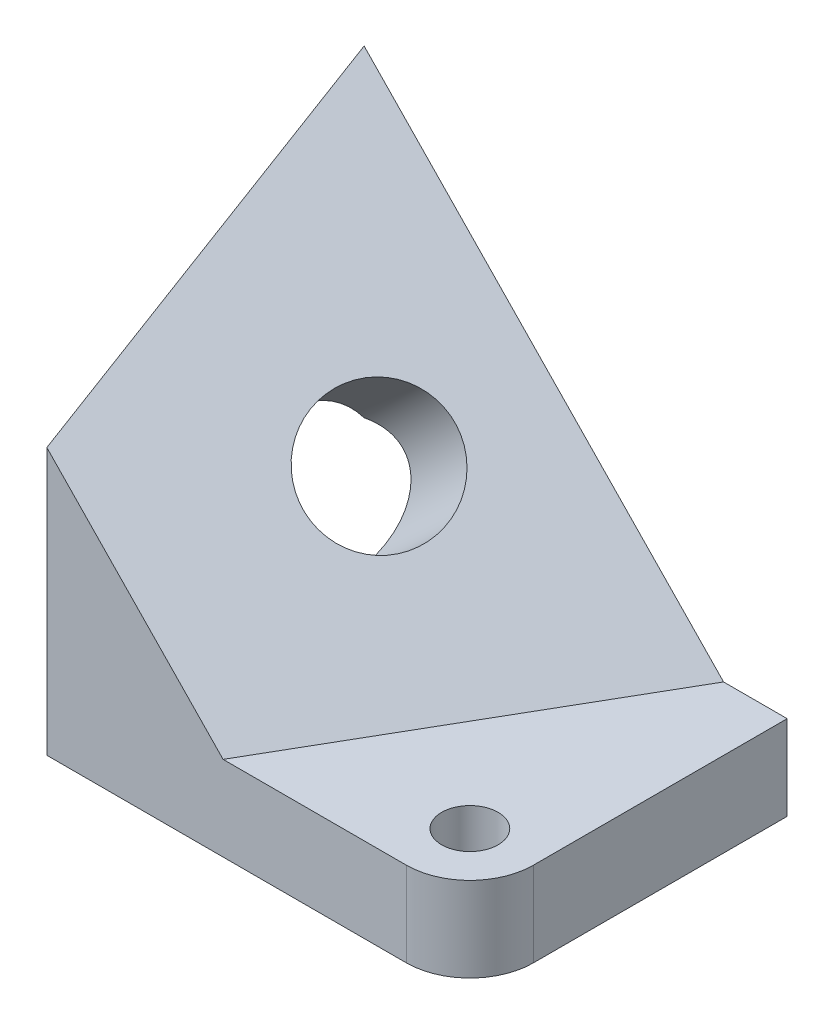
ISO-10303-21;
HEADER;
FILE_DESCRIPTION(('STEP AP214'),'2;1');
FILE_NAME('part.step','',(''),(''),'','','');
FILE_SCHEMA(('AUTOMOTIVE_DESIGN { 1 0 10303 214 1 1 1 1 }'));
ENDSEC;
DATA;
#1=APPLICATION_CONTEXT('core data for automotive mechanical design processes');
#2=APPLICATION_PROTOCOL_DEFINITION('international standard','automotive_design',2000,#1);
#3=PRODUCT_CONTEXT('',#1,'mechanical');
#4=PRODUCT('Part','Part','',(#3));
#5=PRODUCT_RELATED_PRODUCT_CATEGORY('part','',(#4));
#6=PRODUCT_DEFINITION_FORMATION('','',#4);
#7=PRODUCT_DEFINITION_CONTEXT('part definition',#1,'design');
#8=PRODUCT_DEFINITION('design','',#6,#7);
#9=PRODUCT_DEFINITION_SHAPE('','',#8);
#10=(LENGTH_UNIT() NAMED_UNIT(*) SI_UNIT(.MILLI.,.METRE.));
#11=(NAMED_UNIT(*) PLANE_ANGLE_UNIT() SI_UNIT($,.RADIAN.));
#12=(NAMED_UNIT(*) SI_UNIT($,.STERADIAN.) SOLID_ANGLE_UNIT());
#13=UNCERTAINTY_MEASURE_WITH_UNIT(LENGTH_MEASURE(1.E-05),#10,'distance_accuracy_value','');
#14=(GEOMETRIC_REPRESENTATION_CONTEXT(3) GLOBAL_UNCERTAINTY_ASSIGNED_CONTEXT((#13)) GLOBAL_UNIT_ASSIGNED_CONTEXT((#10,
#11,#12)) REPRESENTATION_CONTEXT('',''));
#15=CARTESIAN_POINT('',(0.,0.,0.));
#16=DIRECTION('',(0.,0.,1.));
#17=DIRECTION('',(1.,0.,0.));
#18=AXIS2_PLACEMENT_3D('',#15,#16,#17);
#19=CARTESIAN_POINT('',(21.,12.,13.5));
#20=DIRECTION('',(0.,1.,0.));
#21=DIRECTION('',(0.,0.,1.));
#22=AXIS2_PLACEMENT_3D('',#19,#20,#21);
#23=PLANE('',#22);
#24=DIRECTION('',(0.499999999999998,0.,-0.86602540378444));
#25=VECTOR('',#24,1.);
#26=CARTESIAN_POINT('',(-5.,12.,22.5));
#27=LINE('',#26,#25);
#28=CARTESIAN_POINT('',(-5.,12.,22.5));
#29=VERTEX_POINT('',#28);
#30=CARTESIAN_POINT('',(20.980762113533,12.,-22.5));
#31=VERTEX_POINT('',#30);
#32=EDGE_CURVE('E177',#29,#31,#27,.T.);
#33=ORIENTED_EDGE('',*,*,#32,.F.);
#34=DIRECTION('',(1.,0.,0.));
#35=VECTOR('',#34,1.);
#36=CARTESIAN_POINT('',(-30.,12.,22.5));
#37=LINE('',#36,#35);
#38=CARTESIAN_POINT('',(21.,12.,22.5));
#39=VERTEX_POINT('',#38);
#40=EDGE_CURVE('E170',#29,#39,#37,.T.);
#41=ORIENTED_EDGE('',*,*,#40,.T.);
#42=CARTESIAN_POINT('',(21.,12.,13.5));
#43=DIRECTION('',(0.,1.,0.));
#44=DIRECTION('',(0.,0.,1.));
#45=AXIS2_PLACEMENT_3D('',#42,#43,#44);
#46=CIRCLE('',#45,9.);
#47=CARTESIAN_POINT('',(30.,12.,13.5));
#48=VERTEX_POINT('',#47);
#49=EDGE_CURVE('E146',#39,#48,#46,.T.);
#50=ORIENTED_EDGE('',*,*,#49,.T.);
#51=DIRECTION('',(0.,0.,-1.));
#52=VECTOR('',#51,1.);
#53=CARTESIAN_POINT('',(30.,12.,-22.5));
#54=LINE('',#53,#52);
#55=CARTESIAN_POINT('',(30.,12.,-22.5));
#56=VERTEX_POINT('',#55);
#57=EDGE_CURVE('E127',#48,#56,#54,.T.);
#58=ORIENTED_EDGE('',*,*,#57,.T.);
#59=DIRECTION('',(-1.,0.,0.));
#60=VECTOR('',#59,1.);
#61=CARTESIAN_POINT('',(-30.,12.,-22.5));
#62=LINE('',#61,#60);
#63=EDGE_CURVE('E121',#56,#31,#62,.T.);
#64=ORIENTED_EDGE('',*,*,#63,.T.);
#65=EDGE_LOOP('',(#33,#41,#50,#58,#64));
#66=FACE_BOUND('',#65,.T.);
#67=CARTESIAN_POINT('',(21.,12.,13.5));
#68=DIRECTION('',(0.,1.,0.));
#69=DIRECTION('',(0.,0.,1.));
#70=AXIS2_PLACEMENT_3D('',#67,#68,#69);
#71=CIRCLE('',#70,4.);
#72=CARTESIAN_POINT('',(21.,12.,17.5));
#73=VERTEX_POINT('',#72);
#74=EDGE_CURVE('E164',#73,#73,#71,.T.);
#75=ORIENTED_EDGE('',*,*,#74,.F.);
#76=EDGE_LOOP('',(#75));
#77=FACE_BOUND('',#76,.T.);
#78=ADVANCED_FACE('F41',(#66,#77),#23,.T.);
#79=CARTESIAN_POINT('',(21.,0.,13.5));
#80=DIRECTION('',(0.,1.,0.));
#81=DIRECTION('',(0.,0.,1.));
#82=AXIS2_PLACEMENT_3D('',#79,#80,#81);
#83=PLANE('',#82);
#84=DIRECTION('',(0.,0.,1.));
#85=VECTOR('',#84,1.);
#86=CARTESIAN_POINT('',(-30.,0.,-22.5));
#87=LINE('',#86,#85);
#88=CARTESIAN_POINT('',(-30.,0.,-22.5));
#89=VERTEX_POINT('',#88);
#90=CARTESIAN_POINT('',(-30.,0.,22.5));
#91=VERTEX_POINT('',#90);
#92=EDGE_CURVE('E160',#89,#91,#87,.T.);
#93=ORIENTED_EDGE('',*,*,#92,.F.);
#94=DIRECTION('',(-1.,0.,0.));
#95=VECTOR('',#94,1.);
#96=CARTESIAN_POINT('',(-30.,0.,-22.5));
#97=LINE('',#96,#95);
#98=CARTESIAN_POINT('',(30.,0.,-22.5));
#99=VERTEX_POINT('',#98);
#100=EDGE_CURVE('E118',#99,#89,#97,.T.);
#101=ORIENTED_EDGE('',*,*,#100,.F.);
#102=DIRECTION('',(0.,0.,-1.));
#103=VECTOR('',#102,1.);
#104=CARTESIAN_POINT('',(30.,0.,-22.5));
#105=LINE('',#104,#103);
#106=CARTESIAN_POINT('',(30.,0.,13.5));
#107=VERTEX_POINT('',#106);
#108=EDGE_CURVE('E155',#107,#99,#105,.T.);
#109=ORIENTED_EDGE('',*,*,#108,.F.);
#110=CARTESIAN_POINT('',(21.,0.,13.5));
#111=DIRECTION('',(0.,1.,0.));
#112=DIRECTION('',(0.,0.,1.));
#113=AXIS2_PLACEMENT_3D('',#110,#111,#112);
#114=CIRCLE('',#113,9.);
#115=CARTESIAN_POINT('',(21.,0.,22.5));
#116=VERTEX_POINT('',#115);
#117=EDGE_CURVE('E145',#116,#107,#114,.T.);
#118=ORIENTED_EDGE('',*,*,#117,.F.);
#119=DIRECTION('',(1.,0.,0.));
#120=VECTOR('',#119,1.);
#121=CARTESIAN_POINT('',(-30.,0.,22.5));
#122=LINE('',#121,#120);
#123=EDGE_CURVE('E154',#91,#116,#122,.T.);
#124=ORIENTED_EDGE('',*,*,#123,.F.);
#125=EDGE_LOOP('',(#93,#101,#109,#118,#124));
#126=FACE_BOUND('',#125,.T.);
#127=CARTESIAN_POINT('',(21.,0.,13.5));
#128=DIRECTION('',(0.,1.,0.));
#129=DIRECTION('',(0.,0.,1.));
#130=AXIS2_PLACEMENT_3D('',#127,#128,#129);
#131=CIRCLE('',#130,4.);
#132=CARTESIAN_POINT('',(21.,0.,17.5));
#133=VERTEX_POINT('',#132);
#134=EDGE_CURVE('E173',#133,#133,#131,.T.);
#135=ORIENTED_EDGE('',*,*,#134,.T.);
#136=EDGE_LOOP('',(#135));
#137=FACE_BOUND('',#136,.T.);
#138=ADVANCED_FACE('F152',(#126,#137),#83,.F.);
#139=CARTESIAN_POINT('',(-30.,12.,-22.5));
#140=DIRECTION('',(1.,0.,0.));
#141=DIRECTION('',(0.,0.,-1.));
#142=AXIS2_PLACEMENT_3D('',#139,#140,#141);
#143=PLANE('',#142);
#144=DIRECTION('',(0.,-1.,0.));
#145=VECTOR('',#144,1.);
#146=CARTESIAN_POINT('',(-30.,12.,-22.5));
#147=LINE('',#146,#145);
#148=CARTESIAN_POINT('',(-30.,64.616677989318,-22.5));
#149=VERTEX_POINT('',#148);
#150=CARTESIAN_POINT('',(-30.,18.9520718845685,-22.5));
#151=VERTEX_POINT('',#150);
#152=EDGE_CURVE('E111',#149,#151,#147,.T.);
#153=ORIENTED_EDGE('',*,*,#152,.T.);
#154=CARTESIAN_POINT('',(-30.,12.5856514104136,-15.9448637286707));
#155=DIRECTION('',(1.,0.,0.));
#156=DIRECTION('',(0.,0.859051637355621,0.511888937521243));
#157=AXIS2_PLACEMENT_3D('',#154,#155,#156);
#158=ELLIPSE('',#157,13.5661904981657,9.);
#159=CARTESIAN_POINT('',(-30.,0.718818508669389,-22.5));
#160=VERTEX_POINT('',#159);
#161=EDGE_CURVE('E56',#151,#160,#158,.T.);
#162=ORIENTED_EDGE('',*,*,#161,.T.);
#163=EDGE_CURVE('E108',#160,#89,#147,.T.);
#164=ORIENTED_EDGE('',*,*,#163,.T.);
#165=ORIENTED_EDGE('',*,*,#92,.T.);
#166=DIRECTION('',(0.,-1.,0.));
#167=VECTOR('',#166,1.);
#168=CARTESIAN_POINT('',(-30.,12.,22.5));
#169=LINE('',#168,#167);
#170=CARTESIAN_POINT('',(-30.,37.8022221559487,22.5));
#171=VERTEX_POINT('',#170);
#172=EDGE_CURVE('E11',#171,#91,#169,.T.);
#173=ORIENTED_EDGE('',*,*,#172,.F.);
#174=DIRECTION('',(0.,0.511888937521243,-0.859051637355621));
#175=VECTOR('',#174,1.);
#176=CARTESIAN_POINT('',(-30.,50.829514893876,0.637606936733214));
#177=LINE('',#176,#175);
#178=EDGE_CURVE('E185',#171,#149,#177,.T.);
#179=ORIENTED_EDGE('',*,*,#178,.T.);
#180=EDGE_LOOP('',(#153,#162,#164,#165,#173,#179));
#181=FACE_BOUND('',#180,.T.);
#182=ADVANCED_FACE('F43',(#181),#143,.F.);
#183=CARTESIAN_POINT('',(-30.,12.,22.5));
#184=DIRECTION('',(0.,0.,-1.));
#185=DIRECTION('',(-1.,0.,0.));
#186=AXIS2_PLACEMENT_3D('',#183,#184,#185);
#187=PLANE('',#186);
#188=ORIENTED_EDGE('',*,*,#40,.F.);
#189=DIRECTION('',(-0.6958540455342,0.718183226839563,0.));
#190=VECTOR('',#189,1.);
#191=CARTESIAN_POINT('',(-17.1053213171578,24.4937675957779,22.5));
#192=LINE('',#191,#190);
#193=EDGE_CURVE('E64',#29,#171,#192,.T.);
#194=ORIENTED_EDGE('',*,*,#193,.T.);
#195=ORIENTED_EDGE('',*,*,#172,.T.);
#196=ORIENTED_EDGE('',*,*,#123,.T.);
#197=DIRECTION('',(0.,-1.,0.));
#198=VECTOR('',#197,1.);
#199=CARTESIAN_POINT('',(21.,12.,22.5));
#200=LINE('',#199,#198);
#201=EDGE_CURVE('E50',#39,#116,#200,.T.);
#202=ORIENTED_EDGE('',*,*,#201,.F.);
#203=EDGE_LOOP('',(#188,#194,#195,#196,#202));
#204=FACE_BOUND('',#203,.T.);
#205=ADVANCED_FACE('F209',(#204),#187,.F.);
#206=CARTESIAN_POINT('',(21.,12.,13.5));
#207=DIRECTION('',(0.,-1.,0.));
#208=DIRECTION('',(0.,0.,-1.));
#209=AXIS2_PLACEMENT_3D('',#206,#207,#208);
#210=CYLINDRICAL_SURFACE('',#209,9.);
#211=ORIENTED_EDGE('',*,*,#117,.T.);
#212=DIRECTION('',(0.,-1.,0.));
#213=VECTOR('',#212,1.);
#214=CARTESIAN_POINT('',(30.,12.,13.5));
#215=LINE('',#214,#213);
#216=EDGE_CURVE('E134',#48,#107,#215,.T.);
#217=ORIENTED_EDGE('',*,*,#216,.F.);
#218=ORIENTED_EDGE('',*,*,#49,.F.);
#219=ORIENTED_EDGE('',*,*,#201,.T.);
#220=EDGE_LOOP('',(#211,#217,#218,#219));
#221=FACE_BOUND('',#220,.T.);
#222=ADVANCED_FACE('F143',(#221),#210,.T.);
#223=CARTESIAN_POINT('',(30.,12.,-22.5));
#224=DIRECTION('',(-1.,0.,0.));
#225=DIRECTION('',(0.,0.,1.));
#226=AXIS2_PLACEMENT_3D('',#223,#224,#225);
#227=PLANE('',#226);
#228=ORIENTED_EDGE('',*,*,#108,.T.);
#229=DIRECTION('',(0.,-1.,0.));
#230=VECTOR('',#229,1.);
#231=CARTESIAN_POINT('',(30.,12.,-22.5));
#232=LINE('',#231,#230);
#233=EDGE_CURVE('E125',#56,#99,#232,.T.);
#234=ORIENTED_EDGE('',*,*,#233,.F.);
#235=ORIENTED_EDGE('',*,*,#57,.F.);
#236=ORIENTED_EDGE('',*,*,#216,.T.);
#237=EDGE_LOOP('',(#228,#234,#235,#236));
#238=FACE_BOUND('',#237,.T.);
#239=ADVANCED_FACE('F206',(#238),#227,.F.);
#240=CARTESIAN_POINT('',(-30.,12.,-22.5));
#241=DIRECTION('',(0.,0.,1.));
#242=DIRECTION('',(1.,0.,0.));
#243=AXIS2_PLACEMENT_3D('',#240,#241,#242);
#244=PLANE('',#243);
#245=ORIENTED_EDGE('',*,*,#163,.F.);
#246=CARTESIAN_POINT('',(-41.35382907248,1.584826555235,-22.5));
#247=DIRECTION('',(0.,0.,1.));
#248=DIRECTION('',(0.718183226839563,0.6958540455342,0.));
#249=AXIS2_PLACEMENT_3D('',#246,#247,#248);
#250=ELLIPSE('',#249,23.4973312079812,9.);
#251=EDGE_CURVE('E97',#160,#151,#250,.T.);
#252=ORIENTED_EDGE('',*,*,#251,.T.);
#253=ORIENTED_EDGE('',*,*,#152,.F.);
#254=DIRECTION('',(0.6958540455342,-0.718183226839563,0.));
#255=VECTOR('',#254,1.);
#256=CARTESIAN_POINT('',(-3.70477814158312,37.4776717480848,-22.5));
#257=LINE('',#256,#255);
#258=EDGE_CURVE('E113',#149,#31,#257,.T.);
#259=ORIENTED_EDGE('',*,*,#258,.T.);
#260=ORIENTED_EDGE('',*,*,#63,.F.);
#261=ORIENTED_EDGE('',*,*,#233,.T.);
#262=ORIENTED_EDGE('',*,*,#100,.T.);
#263=EDGE_LOOP('',(#245,#252,#253,#259,#260,#261,#262));
#264=FACE_BOUND('',#263,.T.);
#265=ADVANCED_FACE('F115',(#264),#244,.F.);
#266=CARTESIAN_POINT('',(21.,12.,13.5));
#267=DIRECTION('',(0.,-1.,0.));
#268=DIRECTION('',(0.,0.,-1.));
#269=AXIS2_PLACEMENT_3D('',#266,#267,#268);
#270=CYLINDRICAL_SURFACE('',#269,4.);
#271=ORIENTED_EDGE('',*,*,#74,.T.);
#272=EDGE_LOOP('',(#271));
#273=FACE_BOUND('',#272,.T.);
#274=ORIENTED_EDGE('',*,*,#134,.F.);
#275=EDGE_LOOP('',(#274));
#276=FACE_BOUND('',#275,.T.);
#277=ADVANCED_FACE('F198',(#273,#276),#270,.F.);
#278=CARTESIAN_POINT('',(8.63392225401654,8.36548321481101,4.98479733751872));
#279=DIRECTION('',(-0.663413948168937,-0.642787609686543,-0.383022221559486));
#280=DIRECTION('',(0.6958540455342,-0.718183226839563,0.));
#281=AXIS2_PLACEMENT_3D('',#278,#279,#280);
#282=PLANE('',#281);
#283=CARTESIAN_POINT('',(-9.47786247289274,32.4697309705687,-4.0964021030489));
#284=DIRECTION('',(0.663413948168937,0.642787609686543,0.383022221559486));
#285=DIRECTION('',(-0.6958540455342,0.718183226839563,0.));
#286=AXIS2_PLACEMENT_3D('',#283,#284,#285);
#287=CIRCLE('',#286,9.);
#288=CARTESIAN_POINT('',(-15.7405488827005,38.9333800121248,-4.0964021030489));
#289=VERTEX_POINT('',#288);
#290=EDGE_CURVE('E104',#289,#289,#287,.T.);
#291=ORIENTED_EDGE('',*,*,#290,.F.);
#292=EDGE_LOOP('',(#291));
#293=FACE_BOUND('',#292,.T.);
#294=ORIENTED_EDGE('',*,*,#32,.T.);
#295=ORIENTED_EDGE('',*,*,#258,.F.);
#296=ORIENTED_EDGE('',*,*,#178,.F.);
#297=ORIENTED_EDGE('',*,*,#193,.F.);
#298=EDGE_LOOP('',(#294,#295,#296,#297));
#299=FACE_BOUND('',#298,.T.);
#300=ADVANCED_FACE('F196',(#293,#299),#282,.F.);
#301=CARTESIAN_POINT('',(-37.0326281210895,5.77167616577735,-20.0051534674923));
#302=DIRECTION('',(0.663413948168937,0.642787609686543,0.383022221559486));
#303=DIRECTION('',(-0.6958540455342,0.718183226839563,0.));
#304=AXIS2_PLACEMENT_3D('',#301,#302,#303);
#305=CYLINDRICAL_SURFACE('',#304,9.);
#306=ORIENTED_EDGE('',*,*,#290,.T.);
#307=EDGE_LOOP('',(#306));
#308=FACE_BOUND('',#307,.T.);
#309=ORIENTED_EDGE('',*,*,#251,.F.);
#310=ORIENTED_EDGE('',*,*,#161,.F.);
#311=EDGE_LOOP('',(#309,#310));
#312=FACE_BOUND('',#311,.T.);
#313=ADVANCED_FACE('F98',(#308,#312),#305,.F.);
#314=CLOSED_SHELL('',(#78,#138,#182,#205,#222,#239,#265,#277,#300,#313));
#315=MANIFOLD_SOLID_BREP('B2',#314);
#316=ADVANCED_BREP_SHAPE_REPRESENTATION('',(#18,#315),#14);
#317=SHAPE_DEFINITION_REPRESENTATION(#9,#316);
ENDSEC;
END-ISO-10303-21;
